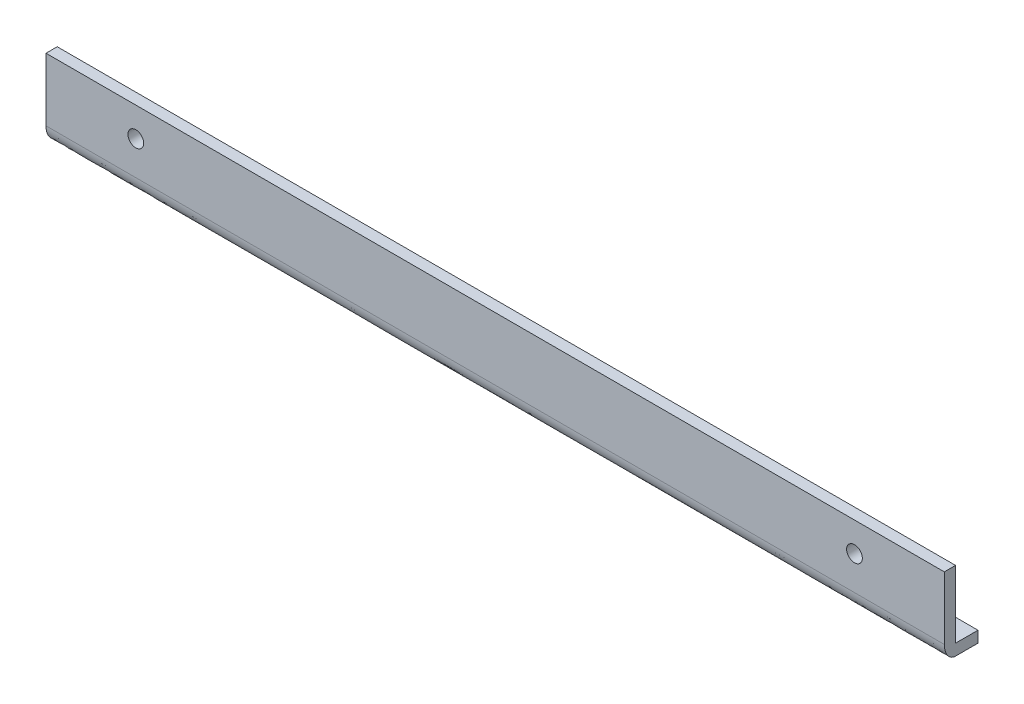
ISO-10303-21;
HEADER;
FILE_DESCRIPTION(('STEP AP214'),'2;1');
FILE_NAME('part.step','',(''),(''),'','','');
FILE_SCHEMA(('AUTOMOTIVE_DESIGN { 1 0 10303 214 1 1 1 1 }'));
ENDSEC;
DATA;
#1=APPLICATION_CONTEXT('core data for automotive mechanical design processes');
#2=APPLICATION_PROTOCOL_DEFINITION('international standard','automotive_design',2000,#1);
#3=PRODUCT_CONTEXT('',#1,'mechanical');
#4=PRODUCT('Part','Part','',(#3));
#5=PRODUCT_RELATED_PRODUCT_CATEGORY('part','',(#4));
#6=PRODUCT_DEFINITION_FORMATION('','',#4);
#7=PRODUCT_DEFINITION_CONTEXT('part definition',#1,'design');
#8=PRODUCT_DEFINITION('design','',#6,#7);
#9=PRODUCT_DEFINITION_SHAPE('','',#8);
#10=(LENGTH_UNIT() NAMED_UNIT(*) SI_UNIT(.MILLI.,.METRE.));
#11=(NAMED_UNIT(*) PLANE_ANGLE_UNIT() SI_UNIT($,.RADIAN.));
#12=(NAMED_UNIT(*) SI_UNIT($,.STERADIAN.) SOLID_ANGLE_UNIT());
#13=UNCERTAINTY_MEASURE_WITH_UNIT(LENGTH_MEASURE(1.E-05),#10,'distance_accuracy_value','');
#14=(GEOMETRIC_REPRESENTATION_CONTEXT(3) GLOBAL_UNCERTAINTY_ASSIGNED_CONTEXT((#13)) GLOBAL_UNIT_ASSIGNED_CONTEXT((#10,
#11,#12)) REPRESENTATION_CONTEXT('',''));
#15=CARTESIAN_POINT('',(0.,0.,0.));
#16=DIRECTION('',(0.,0.,1.));
#17=DIRECTION('',(1.,0.,0.));
#18=AXIS2_PLACEMENT_3D('',#15,#16,#17);
#19=CARTESIAN_POINT('',(272.704402515723,112.91934618496,0.));
#20=CARTESIAN_POINT('',(112.704402515723,112.91934618496,0.));
#21=CARTESIAN_POINT('',(-47.2955974842767,112.91934618496,0.));
#22=CARTESIAN_POINT('',(-207.295597484277,112.91934618496,0.));
#23=CARTESIAN_POINT('',(272.704402515723,112.91934618496,5.00000000000002));
#24=CARTESIAN_POINT('',(112.704402515723,112.91934618496,5.00000000048574));
#25=CARTESIAN_POINT('',(-47.2955974842764,112.91934618496,5.00000000055513));
#26=CARTESIAN_POINT('',(-207.295597484277,112.91934618496,5.00000000000002));
#27=CARTESIAN_POINT('',(272.704402515723,119.91934618496,5.));
#28=CARTESIAN_POINT('',(112.704402515723,119.91934618496,5.));
#29=CARTESIAN_POINT('',(-47.2955974842767,119.91934618496,5.));
#30=CARTESIAN_POINT('',(-207.295597484277,119.91934618496,5.));
#31=(BOUNDED_SURFACE() B_SPLINE_SURFACE(2,3,((#19,#20,#21,#22),(#23,#24,#25,#26),(#27,#28,#29,
#30)),.UNSPECIFIED.,.F.,.F.,.F.) B_SPLINE_SURFACE_WITH_KNOTS((3,3),(4,4),(0.,1.),
(-0.272704402515723,0.207295597484277),
.UNSPECIFIED.) GEOMETRIC_REPRESENTATION_ITEM() RATIONAL_B_SPLINE_SURFACE(((1.,1.,1.,1.),
(0.707106781186547,0.707106781186547,0.707106781186547,0.707106781186547),(1.,1.,1.,1.))) REPRESENTATION_ITEM('') SURFACE());
#32=CARTESIAN_POINT('',(272.704402515723,119.91934618496,5.));
#33=CARTESIAN_POINT('',(112.704402515723,119.91934618496,5.));
#34=CARTESIAN_POINT('',(-47.2955974842767,119.91934618496,5.));
#35=CARTESIAN_POINT('',(-207.295597484277,119.91934618496,5.));
#36=(BOUNDED_CURVE() B_SPLINE_CURVE(3,(#32,#33,#34,#35),.UNSPECIFIED.,.F.,
.F.) B_SPLINE_CURVE_WITH_KNOTS((4,4),(-0.272704402515723,0.207295597484277),
.UNSPECIFIED.) CURVE() GEOMETRIC_REPRESENTATION_ITEM() RATIONAL_B_SPLINE_CURVE((1.,1.,1.,1.)) REPRESENTATION_ITEM(''));
#37=CARTESIAN_POINT('',(-167.295597484277,119.91934618496,5.));
#38=VERTEX_POINT('',#37);
#39=CARTESIAN_POINT('',(232.704402515723,119.91934618496,5.));
#40=VERTEX_POINT('',#39);
#41=EDGE_CURVE('E173',#38,#40,#36,.F.);
#42=CARTESIAN_POINT('',(-167.295597484277,119.91934618496,5.));
#43=CARTESIAN_POINT('',(-167.295597484277,112.91934618496,5.00000000012591));
#44=CARTESIAN_POINT('',(-167.295597484277,112.91934618496,0.));
#45=(BOUNDED_CURVE() B_SPLINE_CURVE(2,(#42,#43,#44),.UNSPECIFIED.,.F.,
.F.) B_SPLINE_CURVE_WITH_KNOTS((3,3),(0.,1.),
.UNSPECIFIED.) CURVE() GEOMETRIC_REPRESENTATION_ITEM() RATIONAL_B_SPLINE_CURVE((1.,
0.707106781186547,1.)) REPRESENTATION_ITEM(''));
#46=CARTESIAN_POINT('',(-167.295597484277,112.91934618496,0.));
#47=VERTEX_POINT('',#46);
#48=EDGE_CURVE('E59',#47,#38,#45,.F.);
#49=CARTESIAN_POINT('',(-207.295597484277,112.91934618496,0.));
#50=CARTESIAN_POINT('',(-47.2955974842767,112.91934618496,0.));
#51=CARTESIAN_POINT('',(112.704402515723,112.91934618496,0.));
#52=CARTESIAN_POINT('',(272.704402515723,112.91934618496,0.));
#53=(BOUNDED_CURVE() B_SPLINE_CURVE(3,(#49,#50,#51,#52),.UNSPECIFIED.,.F.,
.F.) B_SPLINE_CURVE_WITH_KNOTS((4,4),(-0.272704402515723,0.207295597484277),
.UNSPECIFIED.) CURVE() GEOMETRIC_REPRESENTATION_ITEM() RATIONAL_B_SPLINE_CURVE((1.,1.,1.,1.)) REPRESENTATION_ITEM(''));
#54=CARTESIAN_POINT('',(232.704402515723,112.91934618496,0.));
#55=VERTEX_POINT('',#54);
#56=EDGE_CURVE('E224',#55,#47,#53,.F.);
#57=CARTESIAN_POINT('',(232.704402515723,112.91934618496,0.));
#58=CARTESIAN_POINT('',(232.704402515723,112.91934618496,5.00000000011265));
#59=CARTESIAN_POINT('',(232.704402515723,119.91934618496,5.));
#60=(BOUNDED_CURVE() B_SPLINE_CURVE(2,(#57,#58,#59),.UNSPECIFIED.,.F.,
.F.) B_SPLINE_CURVE_WITH_KNOTS((3,3),(0.,1.),
.UNSPECIFIED.) CURVE() GEOMETRIC_REPRESENTATION_ITEM() RATIONAL_B_SPLINE_CURVE((1.,
0.707106781186547,1.)) REPRESENTATION_ITEM(''));
#61=EDGE_CURVE('E12',#40,#55,#60,.F.);
#62=ORIENTED_EDGE('',*,*,#41,.F.);
#63=ORIENTED_EDGE('',*,*,#48,.F.);
#64=ORIENTED_EDGE('',*,*,#56,.F.);
#65=ORIENTED_EDGE('',*,*,#61,.F.);
#66=EDGE_LOOP('',(#62,#63,#64,#65));
#67=FACE_BOUND('',#66,.T.);
#68=ADVANCED_FACE('F46',(#67),#31,.T.);
#69=CARTESIAN_POINT('',(0.,0.,0.));
#70=DIRECTION('',(0.,0.,1.));
#71=DIRECTION('',(1.,0.,0.));
#72=AXIS2_PLACEMENT_3D('',#69,#70,#71);
#73=PLANE('',#72);
#74=CARTESIAN_POINT('',(192.704402515723,134.91934618496,0.));
#75=DIRECTION('',(0.,0.,1.));
#76=DIRECTION('',(-1.,0.,0.));
#77=AXIS2_PLACEMENT_3D('',#74,#75,#76);
#78=CIRCLE('',#77,3.49999999999997);
#79=CARTESIAN_POINT('',(189.204402515723,134.91934618496,0.));
#80=VERTEX_POINT('',#79);
#81=EDGE_CURVE('E142',#80,#80,#78,.T.);
#82=ORIENTED_EDGE('',*,*,#81,.T.);
#83=EDGE_LOOP('',(#82));
#84=FACE_BOUND('',#83,.T.);
#85=CARTESIAN_POINT('',(-127.295597484277,134.91934618496,0.));
#86=DIRECTION('',(0.,0.,1.));
#87=DIRECTION('',(1.,0.,0.));
#88=AXIS2_PLACEMENT_3D('',#85,#86,#87);
#89=CIRCLE('',#88,3.50000000000001);
#90=CARTESIAN_POINT('',(-123.795597484277,134.91934618496,0.));
#91=VERTEX_POINT('',#90);
#92=EDGE_CURVE('E146',#91,#91,#89,.T.);
#93=ORIENTED_EDGE('',*,*,#92,.T.);
#94=EDGE_LOOP('',(#93));
#95=FACE_BOUND('',#94,.T.);
#96=DIRECTION('',(1.,0.,0.));
#97=VECTOR('',#96,1.);
#98=CARTESIAN_POINT('',(232.704402515723,117.91934618496,0.));
#99=LINE('',#98,#97);
#100=CARTESIAN_POINT('',(-167.295597484277,117.91934618496,0.));
#101=VERTEX_POINT('',#100);
#102=CARTESIAN_POINT('',(232.704402515723,117.91934618496,0.));
#103=VERTEX_POINT('',#102);
#104=EDGE_CURVE('E130',#101,#103,#99,.T.);
#105=ORIENTED_EDGE('',*,*,#104,.F.);
#106=DIRECTION('',(0.,-1.,0.));
#107=VECTOR('',#106,1.);
#108=CARTESIAN_POINT('',(-167.295597484277,147.91934618496,0.));
#109=LINE('',#108,#107);
#110=CARTESIAN_POINT('',(-167.295597484277,147.91934618496,0.));
#111=VERTEX_POINT('',#110);
#112=EDGE_CURVE('E152',#111,#101,#109,.T.);
#113=ORIENTED_EDGE('',*,*,#112,.F.);
#114=DIRECTION('',(-1.,0.,0.));
#115=VECTOR('',#114,1.);
#116=CARTESIAN_POINT('',(-167.295597484277,147.91934618496,0.));
#117=LINE('',#116,#115);
#118=CARTESIAN_POINT('',(232.704402515723,147.91934618496,0.));
#119=VERTEX_POINT('',#118);
#120=EDGE_CURVE('E165',#119,#111,#117,.T.);
#121=ORIENTED_EDGE('',*,*,#120,.F.);
#122=DIRECTION('',(0.,1.,0.));
#123=VECTOR('',#122,1.);
#124=CARTESIAN_POINT('',(232.704402515723,147.91934618496,0.));
#125=LINE('',#124,#123);
#126=EDGE_CURVE('E310',#103,#119,#125,.T.);
#127=ORIENTED_EDGE('',*,*,#126,.F.);
#128=EDGE_LOOP('',(#105,#113,#121,#127));
#129=FACE_BOUND('',#128,.T.);
#130=ADVANCED_FACE('F189',(#84,#95,#129),#73,.F.);
#131=CARTESIAN_POINT('',(0.,0.,5.));
#132=DIRECTION('',(0.,0.,1.));
#133=DIRECTION('',(1.,0.,0.));
#134=AXIS2_PLACEMENT_3D('',#131,#132,#133);
#135=PLANE('',#134);
#136=CARTESIAN_POINT('',(-127.295597484277,134.91934618496,5.));
#137=DIRECTION('',(0.,0.,1.));
#138=DIRECTION('',(1.,0.,0.));
#139=AXIS2_PLACEMENT_3D('',#136,#137,#138);
#140=CIRCLE('',#139,3.50000000000001);
#141=CARTESIAN_POINT('',(-123.795597484277,134.91934618496,5.));
#142=VERTEX_POINT('',#141);
#143=EDGE_CURVE('E149',#142,#142,#140,.T.);
#144=ORIENTED_EDGE('',*,*,#143,.F.);
#145=EDGE_LOOP('',(#144));
#146=FACE_BOUND('',#145,.T.);
#147=DIRECTION('',(0.,-1.,0.));
#148=VECTOR('',#147,1.);
#149=CARTESIAN_POINT('',(-167.295597484277,147.91934618496,5.));
#150=LINE('',#149,#148);
#151=CARTESIAN_POINT('',(-167.295597484277,147.91934618496,5.));
#152=VERTEX_POINT('',#151);
#153=EDGE_CURVE('E160',#152,#38,#150,.T.);
#154=ORIENTED_EDGE('',*,*,#153,.T.);
#155=ORIENTED_EDGE('',*,*,#41,.T.);
#156=DIRECTION('',(0.,1.,0.));
#157=VECTOR('',#156,1.);
#158=CARTESIAN_POINT('',(232.704402515723,147.91934618496,5.));
#159=LINE('',#158,#157);
#160=CARTESIAN_POINT('',(232.704402515723,147.91934618496,5.));
#161=VERTEX_POINT('',#160);
#162=EDGE_CURVE('E164',#40,#161,#159,.T.);
#163=ORIENTED_EDGE('',*,*,#162,.T.);
#164=DIRECTION('',(-1.,0.,0.));
#165=VECTOR('',#164,1.);
#166=CARTESIAN_POINT('',(-167.295597484277,147.91934618496,5.));
#167=LINE('',#166,#165);
#168=EDGE_CURVE('E169',#161,#152,#167,.T.);
#169=ORIENTED_EDGE('',*,*,#168,.T.);
#170=EDGE_LOOP('',(#154,#155,#163,#169));
#171=FACE_BOUND('',#170,.T.);
#172=CARTESIAN_POINT('',(192.704402515723,134.91934618496,5.));
#173=DIRECTION('',(0.,0.,1.));
#174=DIRECTION('',(-1.,0.,0.));
#175=AXIS2_PLACEMENT_3D('',#172,#173,#174);
#176=CIRCLE('',#175,3.49999999999997);
#177=CARTESIAN_POINT('',(189.204402515723,134.91934618496,5.));
#178=VERTEX_POINT('',#177);
#179=EDGE_CURVE('E143',#178,#178,#176,.T.);
#180=ORIENTED_EDGE('',*,*,#179,.F.);
#181=EDGE_LOOP('',(#180));
#182=FACE_BOUND('',#181,.T.);
#183=ADVANCED_FACE('F178',(#146,#171,#182),#135,.T.);
#184=CARTESIAN_POINT('',(-167.295597484277,147.91934618496,5.));
#185=DIRECTION('',(1.,0.,0.));
#186=DIRECTION('',(0.,1.,0.));
#187=AXIS2_PLACEMENT_3D('',#184,#185,#186);
#188=PLANE('',#187);
#189=DIRECTION('',(0.,0.,-1.));
#190=VECTOR('',#189,1.);
#191=CARTESIAN_POINT('',(-167.295597484277,112.91934618496,5.));
#192=LINE('',#191,#190);
#193=CARTESIAN_POINT('',(-167.295597484277,112.91934618496,-10.));
#194=VERTEX_POINT('',#193);
#195=EDGE_CURVE('E115',#47,#194,#192,.T.);
#196=ORIENTED_EDGE('',*,*,#195,.F.);
#197=ORIENTED_EDGE('',*,*,#48,.T.);
#198=ORIENTED_EDGE('',*,*,#153,.F.);
#199=DIRECTION('',(0.,0.,-1.));
#200=VECTOR('',#199,1.);
#201=CARTESIAN_POINT('',(-167.295597484277,147.91934618496,5.));
#202=LINE('',#201,#200);
#203=EDGE_CURVE('E315',#152,#111,#202,.T.);
#204=ORIENTED_EDGE('',*,*,#203,.T.);
#205=ORIENTED_EDGE('',*,*,#112,.T.);
#206=DIRECTION('',(0.,0.,1.));
#207=VECTOR('',#206,1.);
#208=CARTESIAN_POINT('',(-167.295597484277,117.91934618496,-10.));
#209=LINE('',#208,#207);
#210=CARTESIAN_POINT('',(-167.295597484277,117.91934618496,-10.));
#211=VERTEX_POINT('',#210);
#212=EDGE_CURVE('E139',#211,#101,#209,.T.);
#213=ORIENTED_EDGE('',*,*,#212,.F.);
#214=DIRECTION('',(0.,1.,0.));
#215=VECTOR('',#214,1.);
#216=CARTESIAN_POINT('',(-167.295597484277,117.91934618496,-10.));
#217=LINE('',#216,#215);
#218=EDGE_CURVE('E124',#194,#211,#217,.T.);
#219=ORIENTED_EDGE('',*,*,#218,.F.);
#220=EDGE_LOOP('',(#196,#197,#198,#204,#205,#213,#219));
#221=FACE_BOUND('',#220,.T.);
#222=ADVANCED_FACE('F188',(#221),#188,.F.);
#223=CARTESIAN_POINT('',(-167.295597484277,112.91934618496,5.));
#224=DIRECTION('',(0.,1.,0.));
#225=DIRECTION('',(0.,0.,1.));
#226=AXIS2_PLACEMENT_3D('',#223,#224,#225);
#227=PLANE('',#226);
#228=DIRECTION('',(0.,0.,-1.));
#229=VECTOR('',#228,1.);
#230=CARTESIAN_POINT('',(232.704402515723,112.91934618496,5.));
#231=LINE('',#230,#229);
#232=CARTESIAN_POINT('',(232.704402515723,112.91934618496,-10.));
#233=VERTEX_POINT('',#232);
#234=EDGE_CURVE('E108',#55,#233,#231,.T.);
#235=ORIENTED_EDGE('',*,*,#234,.F.);
#236=ORIENTED_EDGE('',*,*,#56,.T.);
#237=ORIENTED_EDGE('',*,*,#195,.T.);
#238=DIRECTION('',(-1.,0.,0.));
#239=VECTOR('',#238,1.);
#240=CARTESIAN_POINT('',(232.704402515723,112.91934618496,-10.));
#241=LINE('',#240,#239);
#242=EDGE_CURVE('E119',#233,#194,#241,.T.);
#243=ORIENTED_EDGE('',*,*,#242,.F.);
#244=EDGE_LOOP('',(#235,#236,#237,#243));
#245=FACE_BOUND('',#244,.T.);
#246=ADVANCED_FACE('F120',(#245),#227,.F.);
#247=CARTESIAN_POINT('',(232.704402515723,147.91934618496,5.));
#248=DIRECTION('',(-1.,0.,0.));
#249=DIRECTION('',(0.,-1.,0.));
#250=AXIS2_PLACEMENT_3D('',#247,#248,#249);
#251=PLANE('',#250);
#252=ORIENTED_EDGE('',*,*,#162,.F.);
#253=ORIENTED_EDGE('',*,*,#61,.T.);
#254=ORIENTED_EDGE('',*,*,#234,.T.);
#255=DIRECTION('',(0.,-1.,0.));
#256=VECTOR('',#255,1.);
#257=CARTESIAN_POINT('',(232.704402515723,117.91934618496,-10.));
#258=LINE('',#257,#256);
#259=CARTESIAN_POINT('',(232.704402515723,117.91934618496,-10.));
#260=VERTEX_POINT('',#259);
#261=EDGE_CURVE('E113',#260,#233,#258,.T.);
#262=ORIENTED_EDGE('',*,*,#261,.F.);
#263=DIRECTION('',(0.,0.,1.));
#264=VECTOR('',#263,1.);
#265=CARTESIAN_POINT('',(232.704402515723,117.91934618496,-10.));
#266=LINE('',#265,#264);
#267=EDGE_CURVE('E136',#260,#103,#266,.T.);
#268=ORIENTED_EDGE('',*,*,#267,.T.);
#269=ORIENTED_EDGE('',*,*,#126,.T.);
#270=DIRECTION('',(0.,0.,-1.));
#271=VECTOR('',#270,1.);
#272=CARTESIAN_POINT('',(232.704402515723,147.91934618496,5.));
#273=LINE('',#272,#271);
#274=EDGE_CURVE('E116',#161,#119,#273,.T.);
#275=ORIENTED_EDGE('',*,*,#274,.F.);
#276=EDGE_LOOP('',(#252,#253,#254,#262,#268,#269,#275));
#277=FACE_BOUND('',#276,.T.);
#278=ADVANCED_FACE('F110',(#277),#251,.F.);
#279=CARTESIAN_POINT('',(-167.295597484277,147.91934618496,5.));
#280=DIRECTION('',(0.,-1.,0.));
#281=DIRECTION('',(0.,0.,-1.));
#282=AXIS2_PLACEMENT_3D('',#279,#280,#281);
#283=PLANE('',#282);
#284=ORIENTED_EDGE('',*,*,#120,.T.);
#285=ORIENTED_EDGE('',*,*,#203,.F.);
#286=ORIENTED_EDGE('',*,*,#168,.F.);
#287=ORIENTED_EDGE('',*,*,#274,.T.);
#288=EDGE_LOOP('',(#284,#285,#286,#287));
#289=FACE_BOUND('',#288,.T.);
#290=ADVANCED_FACE('F196',(#289),#283,.F.);
#291=CARTESIAN_POINT('',(-127.295597484277,134.91934618496,5.));
#292=DIRECTION('',(0.,0.,-1.));
#293=DIRECTION('',(-1.,0.,0.));
#294=AXIS2_PLACEMENT_3D('',#291,#292,#293);
#295=CYLINDRICAL_SURFACE('',#294,3.50000000000001);
#296=ORIENTED_EDGE('',*,*,#143,.T.);
#297=EDGE_LOOP('',(#296));
#298=FACE_BOUND('',#297,.T.);
#299=ORIENTED_EDGE('',*,*,#92,.F.);
#300=EDGE_LOOP('',(#299));
#301=FACE_BOUND('',#300,.T.);
#302=ADVANCED_FACE('F191',(#298,#301),#295,.F.);
#303=CARTESIAN_POINT('',(192.704402515723,134.91934618496,5.));
#304=DIRECTION('',(0.,0.,-1.));
#305=DIRECTION('',(-1.,0.,0.));
#306=AXIS2_PLACEMENT_3D('',#303,#304,#305);
#307=CYLINDRICAL_SURFACE('',#306,3.49999999999997);
#308=ORIENTED_EDGE('',*,*,#179,.T.);
#309=EDGE_LOOP('',(#308));
#310=FACE_BOUND('',#309,.T.);
#311=ORIENTED_EDGE('',*,*,#81,.F.);
#312=EDGE_LOOP('',(#311));
#313=FACE_BOUND('',#312,.T.);
#314=ADVANCED_FACE('F283',(#310,#313),#307,.F.);
#315=CARTESIAN_POINT('',(232.704402515723,117.91934618496,-10.));
#316=DIRECTION('',(0.,-1.,0.));
#317=DIRECTION('',(0.,0.,-1.));
#318=AXIS2_PLACEMENT_3D('',#315,#316,#317);
#319=PLANE('',#318);
#320=ORIENTED_EDGE('',*,*,#104,.T.);
#321=ORIENTED_EDGE('',*,*,#267,.F.);
#322=DIRECTION('',(1.,0.,0.));
#323=VECTOR('',#322,1.);
#324=CARTESIAN_POINT('',(232.704402515723,117.91934618496,-10.));
#325=LINE('',#324,#323);
#326=EDGE_CURVE('E128',#211,#260,#325,.T.);
#327=ORIENTED_EDGE('',*,*,#326,.F.);
#328=ORIENTED_EDGE('',*,*,#212,.T.);
#329=EDGE_LOOP('',(#320,#321,#327,#328));
#330=FACE_BOUND('',#329,.T.);
#331=ADVANCED_FACE('F279',(#330),#319,.F.);
#332=CARTESIAN_POINT('',(0.,0.,-10.));
#333=DIRECTION('',(0.,0.,-1.));
#334=DIRECTION('',(-1.,0.,0.));
#335=AXIS2_PLACEMENT_3D('',#332,#333,#334);
#336=PLANE('',#335);
#337=ORIENTED_EDGE('',*,*,#261,.T.);
#338=ORIENTED_EDGE('',*,*,#242,.T.);
#339=ORIENTED_EDGE('',*,*,#218,.T.);
#340=ORIENTED_EDGE('',*,*,#326,.T.);
#341=EDGE_LOOP('',(#337,#338,#339,#340));
#342=FACE_BOUND('',#341,.T.);
#343=ADVANCED_FACE('F126',(#342),#336,.T.);
#344=CLOSED_SHELL('',(#68,#130,#183,#222,#246,#278,#290,#302,#314,#331,#343));
#345=MANIFOLD_SOLID_BREP('B2',#344);
#346=ADVANCED_BREP_SHAPE_REPRESENTATION('',(#18,#345),#14);
#347=SHAPE_DEFINITION_REPRESENTATION(#9,#346);
ENDSEC;
END-ISO-10303-21;
